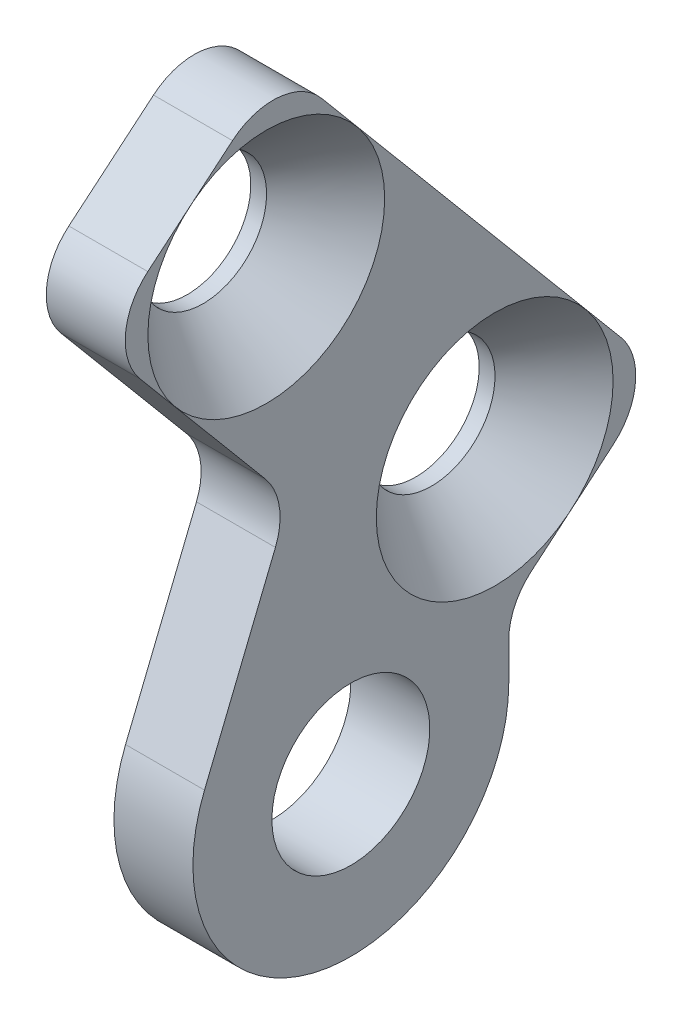
ISO-10303-21;
HEADER;
FILE_DESCRIPTION(('STEP AP214'),'2;1');
FILE_NAME('part.step','',(''),(''),'','','');
FILE_SCHEMA(('AUTOMOTIVE_DESIGN { 1 0 10303 214 1 1 1 1 }'));
ENDSEC;
DATA;
#1=APPLICATION_CONTEXT('core data for automotive mechanical design processes');
#2=APPLICATION_PROTOCOL_DEFINITION('international standard','automotive_design',2000,#1);
#3=PRODUCT_CONTEXT('',#1,'mechanical');
#4=PRODUCT('Part','Part','',(#3));
#5=PRODUCT_RELATED_PRODUCT_CATEGORY('part','',(#4));
#6=PRODUCT_DEFINITION_FORMATION('','',#4);
#7=PRODUCT_DEFINITION_CONTEXT('part definition',#1,'design');
#8=PRODUCT_DEFINITION('design','',#6,#7);
#9=PRODUCT_DEFINITION_SHAPE('','',#8);
#10=(LENGTH_UNIT() NAMED_UNIT(*) SI_UNIT(.MILLI.,.METRE.));
#11=(NAMED_UNIT(*) PLANE_ANGLE_UNIT() SI_UNIT($,.RADIAN.));
#12=(NAMED_UNIT(*) SI_UNIT($,.STERADIAN.) SOLID_ANGLE_UNIT());
#13=UNCERTAINTY_MEASURE_WITH_UNIT(LENGTH_MEASURE(1.E-05),#10,'distance_accuracy_value','');
#14=(GEOMETRIC_REPRESENTATION_CONTEXT(3) GLOBAL_UNCERTAINTY_ASSIGNED_CONTEXT((#13)) GLOBAL_UNIT_ASSIGNED_CONTEXT((#10,
#11,#12)) REPRESENTATION_CONTEXT('',''));
#15=CARTESIAN_POINT('',(0.,0.,0.));
#16=DIRECTION('',(0.,0.,1.));
#17=DIRECTION('',(1.,0.,0.));
#18=AXIS2_PLACEMENT_3D('',#15,#16,#17);
#19=CARTESIAN_POINT('',(-1.5875,9.52500000000001,-176.47164647412));
#20=DIRECTION('',(-1.,0.,0.));
#21=DIRECTION('',(0.,0.,1.));
#22=AXIS2_PLACEMENT_3D('',#19,#20,#21);
#23=PLANE('',#22);
#24=CARTESIAN_POINT('',(-1.58750000000001,9.52500000000001,-176.47164647412));
#25=DIRECTION('',(-1.,0.,0.));
#26=DIRECTION('',(0.,0.,1.));
#27=AXIS2_PLACEMENT_3D('',#24,#25,#26);
#28=CIRCLE('',#27,3.175);
#29=CARTESIAN_POINT('',(-1.58750000000001,9.52500000000001,-173.29664647412));
#30=VERTEX_POINT('',#29);
#31=EDGE_CURVE('E168',#30,#30,#28,.T.);
#32=ORIENTED_EDGE('',*,*,#31,.F.);
#33=EDGE_LOOP('',(#32));
#34=FACE_BOUND('',#33,.T.);
#35=CARTESIAN_POINT('',(-1.5875,28.8892429303716,-173.071588618471));
#36=DIRECTION('',(-1.,0.,0.));
#37=DIRECTION('',(0.,0.,1.));
#38=AXIS2_PLACEMENT_3D('',#35,#36,#37);
#39=CIRCLE('',#38,2.55269999999998);
#40=CARTESIAN_POINT('',(-1.5875,28.8892429303716,-170.518888618471));
#41=VERTEX_POINT('',#40);
#42=EDGE_CURVE('E256',#41,#41,#39,.T.);
#43=ORIENTED_EDGE('',*,*,#42,.F.);
#44=EDGE_LOOP('',(#43));
#45=FACE_BOUND('',#44,.T.);
#46=DIRECTION('',(0.,0.766044443118974,0.642787609686545));
#47=VECTOR('',#46,1.);
#48=CARTESIAN_POINT('',(-1.5875,81.5666029531743,-122.653033036499));
#49=LINE('',#48,#47);
#50=CARTESIAN_POINT('',(-1.5875,21.5268788651857,-173.032343374717));
#51=VERTEX_POINT('',#50);
#52=CARTESIAN_POINT('',(-1.5875,27.5305007140713,-167.994706495589));
#53=VERTEX_POINT('',#52);
#54=EDGE_CURVE('E143',#51,#53,#49,.T.);
#55=ORIENTED_EDGE('',*,*,#54,.T.);
#56=CARTESIAN_POINT('',(-1.5875,29.1631812426751,-169.940459381111));
#57=DIRECTION('',(-1.,0.,0.));
#58=DIRECTION('',(0.,0.,1.));
#59=AXIS2_PLACEMENT_3D('',#56,#57,#58);
#60=CIRCLE('',#59,2.54);
#61=CARTESIAN_POINT('',(-1.5875,31.1089341281973,-168.307778852507));
#62=VERTEX_POINT('',#61);
#63=EDGE_CURVE('E188',#53,#62,#60,.T.);
#64=ORIENTED_EDGE('',*,*,#63,.T.);
#65=DIRECTION('',(0.,0.642787609686545,-0.766044443118973));
#66=VECTOR('',#65,1.);
#67=CARTESIAN_POINT('',(-1.5875,30.4596506464192,-167.533992930486));
#68=LINE('',#67,#66);
#69=CARTESIAN_POINT('',(-1.5875,33.966125053254,-171.712846402171));
#70=VERTEX_POINT('',#69);
#71=EDGE_CURVE('E268',#62,#70,#68,.T.);
#72=ORIENTED_EDGE('',*,*,#71,.T.);
#73=CARTESIAN_POINT('',(-1.5875,32.0203721677318,-173.345526930775));
#74=DIRECTION('',(-1.,0.,0.));
#75=DIRECTION('',(0.,0.,1.));
#76=AXIS2_PLACEMENT_3D('',#73,#74,#75);
#77=CIRCLE('',#76,2.54);
#78=CARTESIAN_POINT('',(-1.5875,33.6530526963356,-175.291279816297));
#79=VERTEX_POINT('',#78);
#80=EDGE_CURVE('E186',#70,#79,#77,.T.);
#81=ORIENTED_EDGE('',*,*,#80,.T.);
#82=DIRECTION('',(0.,-0.766044443118974,-0.642787609686544));
#83=VECTOR('',#82,1.);
#84=CARTESIAN_POINT('',(-1.5875,87.6891549354387,-129.949606357207));
#85=LINE('',#84,#83);
#86=CARTESIAN_POINT('',(-1.5875,19.3031251656094,-187.33229871475));
#87=VERTEX_POINT('',#86);
#88=EDGE_CURVE('E265',#79,#87,#85,.T.);
#89=ORIENTED_EDGE('',*,*,#88,.T.);
#90=CARTESIAN_POINT('',(-1.5875,17.6704446370056,-185.386545829228));
#91=DIRECTION('',(-1.,0.,0.));
#92=DIRECTION('',(0.,0.,1.));
#93=AXIS2_PLACEMENT_3D('',#90,#91,#92);
#94=CIRCLE('',#93,2.54);
#95=CARTESIAN_POINT('',(-1.5875,15.7246917514834,-187.019226357832));
#96=VERTEX_POINT('',#95);
#97=EDGE_CURVE('E184',#87,#96,#94,.T.);
#98=ORIENTED_EDGE('',*,*,#97,.T.);
#99=DIRECTION('',(0.,-0.642787609686544,0.766044443118974));
#100=VECTOR('',#99,1.);
#101=CARTESIAN_POINT('',(-1.5875,12.2182173446486,-182.840372886147));
#102=LINE('',#101,#100);
#103=CARTESIAN_POINT('',(-1.5875,12.9638354530325,-183.728965945517));
#104=VERTEX_POINT('',#103);
#105=EDGE_CURVE('E263',#96,#104,#102,.T.);
#106=ORIENTED_EDGE('',*,*,#105,.T.);
#107=CARTESIAN_POINT('',(-1.5875,11.0180825675103,-185.36164647412));
#108=DIRECTION('',(-1.,0.,0.));
#109=DIRECTION('',(0.,0.,1.));
#110=AXIS2_PLACEMENT_3D('',#107,#108,#109);
#111=CIRCLE('',#110,2.54);
#112=CARTESIAN_POINT('',(-1.5875,11.0180825675103,-182.82164647412));
#113=VERTEX_POINT('',#112);
#114=EDGE_CURVE('E57',#104,#113,#111,.F.);
#115=ORIENTED_EDGE('',*,*,#114,.T.);
#116=DIRECTION('',(0.,-1.,0.));
#117=VECTOR('',#116,1.);
#118=CARTESIAN_POINT('',(-1.5875,82.55,-182.82164647412));
#119=LINE('',#118,#117);
#120=CARTESIAN_POINT('',(-1.5875,9.52500000000001,-182.82164647412));
#121=VERTEX_POINT('',#120);
#122=EDGE_CURVE('E149',#113,#121,#119,.T.);
#123=ORIENTED_EDGE('',*,*,#122,.T.);
#124=CARTESIAN_POINT('',(-1.5875,9.52500000000001,-176.47164647412));
#125=DIRECTION('',(-1.,0.,0.));
#126=DIRECTION('',(0.,0.,1.));
#127=AXIS2_PLACEMENT_3D('',#124,#125,#126);
#128=CIRCLE('',#127,6.34999999999999);
#129=CARTESIAN_POINT('',(-1.5875,11.9135952794059,-170.588015572101));
#130=VERTEX_POINT('',#129);
#131=EDGE_CURVE('E144',#121,#130,#128,.T.);
#132=ORIENTED_EDGE('',*,*,#131,.T.);
#133=DIRECTION('',(0.,0.926556047562137,-0.376156736914323));
#134=VECTOR('',#133,1.);
#135=CARTESIAN_POINT('',(-1.5875,56.2570524500952,-188.590261843887));
#136=LINE('',#135,#134);
#137=CARTESIAN_POINT('',(-1.5875,18.9387602248195,-173.440042850002));
#138=VERTEX_POINT('',#137);
#139=EDGE_CURVE('E133',#130,#138,#136,.T.);
#140=ORIENTED_EDGE('',*,*,#139,.T.);
#141=CARTESIAN_POINT('',(-1.5875,19.8941983365819,-171.086590489194));
#142=DIRECTION('',(-1.,0.,0.));
#143=DIRECTION('',(0.,0.,1.));
#144=AXIS2_PLACEMENT_3D('',#141,#142,#143);
#145=CIRCLE('',#144,2.54);
#146=EDGE_CURVE('E204',#138,#51,#145,.F.);
#147=ORIENTED_EDGE('',*,*,#146,.T.);
#148=EDGE_LOOP('',(#55,#64,#72,#81,#89,#98,#106,#115,#123,#132,#140,#147));
#149=FACE_BOUND('',#148,.T.);
#150=CARTESIAN_POINT('',(-1.5875,17.9443829493092,-182.255416591868));
#151=DIRECTION('',(-1.,0.,0.));
#152=DIRECTION('',(0.,0.,1.));
#153=AXIS2_PLACEMENT_3D('',#150,#151,#152);
#154=CIRCLE('',#153,2.55270000000004);
#155=CARTESIAN_POINT('',(-1.5875,17.9443829493092,-179.702716591868));
#156=VERTEX_POINT('',#155);
#157=EDGE_CURVE('E259',#156,#156,#154,.T.);
#158=ORIENTED_EDGE('',*,*,#157,.F.);
#159=EDGE_LOOP('',(#158));
#160=FACE_BOUND('',#159,.T.);
#161=ADVANCED_FACE('F41',(#34,#45,#149,#160),#23,.T.);
#162=CARTESIAN_POINT('',(1.5875,9.52500000000001,-176.47164647412));
#163=DIRECTION('',(-1.,0.,0.));
#164=DIRECTION('',(0.,0.,1.));
#165=AXIS2_PLACEMENT_3D('',#162,#163,#164);
#166=PLANE('',#165);
#167=CARTESIAN_POINT('',(1.5875,17.9443829493092,-182.255416591868));
#168=DIRECTION('',(-1.,0.,0.));
#169=DIRECTION('',(0.,0.,1.));
#170=AXIS2_PLACEMENT_3D('',#167,#168,#169);
#171=CIRCLE('',#170,4.76068831405327);
#172=CARTESIAN_POINT('',(1.5875,17.9443829493092,-177.494728277814));
#173=VERTEX_POINT('',#172);
#174=EDGE_CURVE('E212',#173,#173,#171,.T.);
#175=ORIENTED_EDGE('',*,*,#174,.T.);
#176=EDGE_LOOP('',(#175));
#177=FACE_BOUND('',#176,.T.);
#178=CARTESIAN_POINT('',(1.5875,28.8892429303716,-173.071588618471));
#179=DIRECTION('',(-1.,0.,0.));
#180=DIRECTION('',(0.,0.,1.));
#181=AXIS2_PLACEMENT_3D('',#178,#179,#180);
#182=CIRCLE('',#181,4.76068831405321);
#183=CARTESIAN_POINT('',(1.5875,28.8892429303716,-168.310900304418));
#184=VERTEX_POINT('',#183);
#185=EDGE_CURVE('E209',#184,#184,#182,.T.);
#186=ORIENTED_EDGE('',*,*,#185,.T.);
#187=EDGE_LOOP('',(#186));
#188=FACE_BOUND('',#187,.T.);
#189=CARTESIAN_POINT('',(1.5875,9.52500000000001,-176.47164647412));
#190=DIRECTION('',(-1.,0.,0.));
#191=DIRECTION('',(0.,0.,1.));
#192=AXIS2_PLACEMENT_3D('',#189,#190,#191);
#193=CIRCLE('',#192,3.175);
#194=CARTESIAN_POINT('',(1.5875,9.52500000000001,-173.29664647412));
#195=VERTEX_POINT('',#194);
#196=EDGE_CURVE('E166',#195,#195,#193,.T.);
#197=ORIENTED_EDGE('',*,*,#196,.T.);
#198=EDGE_LOOP('',(#197));
#199=FACE_BOUND('',#198,.T.);
#200=DIRECTION('',(0.,0.642787609686545,-0.766044443118973));
#201=VECTOR('',#200,1.);
#202=CARTESIAN_POINT('',(1.5875,30.4596506464192,-167.533992930486));
#203=LINE('',#202,#201);
#204=CARTESIAN_POINT('',(1.5875,31.1089341281973,-168.307778852507));
#205=VERTEX_POINT('',#204);
#206=CARTESIAN_POINT('',(1.5875,33.966125053254,-171.712846402171));
#207=VERTEX_POINT('',#206);
#208=EDGE_CURVE('E236',#205,#207,#203,.T.);
#209=ORIENTED_EDGE('',*,*,#208,.F.);
#210=CARTESIAN_POINT('',(1.5875,29.1631812426751,-169.940459381111));
#211=DIRECTION('',(-1.,0.,0.));
#212=DIRECTION('',(0.,0.,1.));
#213=AXIS2_PLACEMENT_3D('',#210,#211,#212);
#214=CIRCLE('',#213,2.54);
#215=CARTESIAN_POINT('',(1.5875,27.5305007140713,-167.994706495589));
#216=VERTEX_POINT('',#215);
#217=EDGE_CURVE('E182',#205,#216,#214,.F.);
#218=ORIENTED_EDGE('',*,*,#217,.T.);
#219=DIRECTION('',(0.,0.766044443118974,0.642787609686545));
#220=VECTOR('',#219,1.);
#221=CARTESIAN_POINT('',(1.5875,81.5666029531743,-122.653033036499));
#222=LINE('',#221,#220);
#223=CARTESIAN_POINT('',(1.5875,21.5268788651857,-173.032343374717));
#224=VERTEX_POINT('',#223);
#225=EDGE_CURVE('E243',#224,#216,#222,.T.);
#226=ORIENTED_EDGE('',*,*,#225,.F.);
#227=CARTESIAN_POINT('',(1.5875,19.8941983365819,-171.086590489194));
#228=DIRECTION('',(-1.,0.,0.));
#229=DIRECTION('',(0.,0.,1.));
#230=AXIS2_PLACEMENT_3D('',#227,#228,#229);
#231=CIRCLE('',#230,2.54);
#232=CARTESIAN_POINT('',(1.5875,18.9387602248195,-173.440042850002));
#233=VERTEX_POINT('',#232);
#234=EDGE_CURVE('E202',#224,#233,#231,.T.);
#235=ORIENTED_EDGE('',*,*,#234,.T.);
#236=DIRECTION('',(0.,0.926556047562137,-0.376156736914323));
#237=VECTOR('',#236,1.);
#238=CARTESIAN_POINT('',(1.5875,56.2570524500952,-188.590261843887));
#239=LINE('',#238,#237);
#240=CARTESIAN_POINT('',(1.5875,11.9135952794059,-170.588015572101));
#241=VERTEX_POINT('',#240);
#242=EDGE_CURVE('E248',#241,#233,#239,.T.);
#243=ORIENTED_EDGE('',*,*,#242,.F.);
#244=CARTESIAN_POINT('',(1.5875,9.52500000000001,-176.47164647412));
#245=DIRECTION('',(-1.,0.,0.));
#246=DIRECTION('',(0.,0.,1.));
#247=AXIS2_PLACEMENT_3D('',#244,#245,#246);
#248=CIRCLE('',#247,6.34999999999999);
#249=CARTESIAN_POINT('',(1.5875,9.52500000000001,-182.82164647412));
#250=VERTEX_POINT('',#249);
#251=EDGE_CURVE('E157',#250,#241,#248,.T.);
#252=ORIENTED_EDGE('',*,*,#251,.F.);
#253=DIRECTION('',(0.,-1.,0.));
#254=VECTOR('',#253,1.);
#255=CARTESIAN_POINT('',(1.5875,82.55,-182.82164647412));
#256=LINE('',#255,#254);
#257=CARTESIAN_POINT('',(1.5875,11.0180825675103,-182.82164647412));
#258=VERTEX_POINT('',#257);
#259=EDGE_CURVE('E153',#258,#250,#256,.T.);
#260=ORIENTED_EDGE('',*,*,#259,.F.);
#261=CARTESIAN_POINT('',(1.5875,11.0180825675103,-185.36164647412));
#262=DIRECTION('',(-1.,0.,0.));
#263=DIRECTION('',(0.,0.,1.));
#264=AXIS2_PLACEMENT_3D('',#261,#262,#263);
#265=CIRCLE('',#264,2.54);
#266=CARTESIAN_POINT('',(1.5875,12.9638354530325,-183.728965945517));
#267=VERTEX_POINT('',#266);
#268=EDGE_CURVE('E206',#258,#267,#265,.T.);
#269=ORIENTED_EDGE('',*,*,#268,.T.);
#270=DIRECTION('',(0.,-0.642787609686544,0.766044443118974));
#271=VECTOR('',#270,1.);
#272=CARTESIAN_POINT('',(1.5875,12.2182173446486,-182.840372886147));
#273=LINE('',#272,#271);
#274=CARTESIAN_POINT('',(1.5875,15.7246917514834,-187.019226357832));
#275=VERTEX_POINT('',#274);
#276=EDGE_CURVE('E246',#275,#267,#273,.T.);
#277=ORIENTED_EDGE('',*,*,#276,.F.);
#278=CARTESIAN_POINT('',(1.5875,17.6704446370056,-185.386545829228));
#279=DIRECTION('',(-1.,0.,0.));
#280=DIRECTION('',(0.,0.,1.));
#281=AXIS2_PLACEMENT_3D('',#278,#279,#280);
#282=CIRCLE('',#281,2.54);
#283=CARTESIAN_POINT('',(1.5875,19.3031251656094,-187.33229871475));
#284=VERTEX_POINT('',#283);
#285=EDGE_CURVE('E178',#275,#284,#282,.F.);
#286=ORIENTED_EDGE('',*,*,#285,.T.);
#287=DIRECTION('',(0.,-0.766044443118974,-0.642787609686544));
#288=VECTOR('',#287,1.);
#289=CARTESIAN_POINT('',(1.5875,87.6891549354387,-129.949606357207));
#290=LINE('',#289,#288);
#291=CARTESIAN_POINT('',(1.5875,33.6530526963356,-175.291279816297));
#292=VERTEX_POINT('',#291);
#293=EDGE_CURVE('E242',#292,#284,#290,.T.);
#294=ORIENTED_EDGE('',*,*,#293,.F.);
#295=CARTESIAN_POINT('',(1.5875,32.0203721677318,-173.345526930775));
#296=DIRECTION('',(-1.,0.,0.));
#297=DIRECTION('',(0.,0.,1.));
#298=AXIS2_PLACEMENT_3D('',#295,#296,#297);
#299=CIRCLE('',#298,2.54);
#300=EDGE_CURVE('E180',#292,#207,#299,.F.);
#301=ORIENTED_EDGE('',*,*,#300,.T.);
#302=EDGE_LOOP('',(#209,#218,#226,#235,#243,#252,#260,#269,#277,#286,#294,#301));
#303=FACE_BOUND('',#302,.T.);
#304=ADVANCED_FACE('F226',(#177,#188,#199,#303),#166,.F.);
#305=CARTESIAN_POINT('',(-1.5875,9.52500000000001,-176.47164647412));
#306=DIRECTION('',(1.,0.,0.));
#307=DIRECTION('',(0.,0.,-1.));
#308=AXIS2_PLACEMENT_3D('',#305,#306,#307);
#309=CYLINDRICAL_SURFACE('',#308,6.34999999999999);
#310=ORIENTED_EDGE('',*,*,#251,.T.);
#311=DIRECTION('',(1.,0.,0.));
#312=VECTOR('',#311,1.);
#313=CARTESIAN_POINT('',(-1.5875,11.9135952794059,-170.588015572101));
#314=LINE('',#313,#312);
#315=EDGE_CURVE('E138',#130,#241,#314,.T.);
#316=ORIENTED_EDGE('',*,*,#315,.F.);
#317=ORIENTED_EDGE('',*,*,#131,.F.);
#318=DIRECTION('',(1.,0.,0.));
#319=VECTOR('',#318,1.);
#320=CARTESIAN_POINT('',(-1.5875,9.52500000000001,-182.82164647412));
#321=LINE('',#320,#319);
#322=EDGE_CURVE('E159',#121,#250,#321,.T.);
#323=ORIENTED_EDGE('',*,*,#322,.T.);
#324=EDGE_LOOP('',(#310,#316,#317,#323));
#325=FACE_BOUND('',#324,.T.);
#326=ADVANCED_FACE('F155',(#325),#309,.T.);
#327=CARTESIAN_POINT('',(-1.5875,56.2570524500952,-188.590261843887));
#328=DIRECTION('',(0.,-0.376156736914323,-0.926556047562137));
#329=DIRECTION('',(0.,0.926556047562137,-0.376156736914323));
#330=AXIS2_PLACEMENT_3D('',#327,#328,#329);
#331=PLANE('',#330);
#332=ORIENTED_EDGE('',*,*,#242,.T.);
#333=DIRECTION('',(1.,0.,0.));
#334=VECTOR('',#333,1.);
#335=CARTESIAN_POINT('',(-1.5875,18.9387602248195,-173.440042850002));
#336=LINE('',#335,#334);
#337=EDGE_CURVE('E141',#233,#138,#336,.F.);
#338=ORIENTED_EDGE('',*,*,#337,.T.);
#339=ORIENTED_EDGE('',*,*,#139,.F.);
#340=ORIENTED_EDGE('',*,*,#315,.T.);
#341=EDGE_LOOP('',(#332,#338,#339,#340));
#342=FACE_BOUND('',#341,.T.);
#343=ADVANCED_FACE('F136',(#342),#331,.F.);
#344=CARTESIAN_POINT('',(-1.5875,81.5666029531743,-122.653033036499));
#345=DIRECTION('',(0.,0.642787609686545,-0.766044443118973));
#346=DIRECTION('',(0.,0.766044443118974,0.642787609686545));
#347=AXIS2_PLACEMENT_3D('',#344,#345,#346);
#348=PLANE('',#347);
#349=ORIENTED_EDGE('',*,*,#54,.F.);
#350=DIRECTION('',(1.,0.,0.));
#351=VECTOR('',#350,1.);
#352=CARTESIAN_POINT('',(1.5875,21.5268788651857,-173.032343374717));
#353=LINE('',#352,#351);
#354=EDGE_CURVE('E161',#51,#224,#353,.T.);
#355=ORIENTED_EDGE('',*,*,#354,.T.);
#356=ORIENTED_EDGE('',*,*,#225,.T.);
#357=DIRECTION('',(1.,0.,0.));
#358=VECTOR('',#357,1.);
#359=CARTESIAN_POINT('',(-1.5875,27.5305007140713,-167.994706495589));
#360=LINE('',#359,#358);
#361=EDGE_CURVE('E158',#216,#53,#360,.F.);
#362=ORIENTED_EDGE('',*,*,#361,.T.);
#363=EDGE_LOOP('',(#349,#355,#356,#362));
#364=FACE_BOUND('',#363,.T.);
#365=ADVANCED_FACE('F307',(#364),#348,.F.);
#366=CARTESIAN_POINT('',(-1.5875,30.4596506464192,-167.533992930486));
#367=DIRECTION('',(0.,-0.766044443118973,-0.642787609686545));
#368=DIRECTION('',(0.,0.642787609686545,-0.766044443118973));
#369=AXIS2_PLACEMENT_3D('',#366,#367,#368);
#370=PLANE('',#369);
#371=ORIENTED_EDGE('',*,*,#71,.F.);
#372=DIRECTION('',(1.,0.,0.));
#373=VECTOR('',#372,1.);
#374=CARTESIAN_POINT('',(-1.5875,31.1089341281973,-168.307778852507));
#375=LINE('',#374,#373);
#376=EDGE_CURVE('E175',#62,#205,#375,.T.);
#377=ORIENTED_EDGE('',*,*,#376,.T.);
#378=ORIENTED_EDGE('',*,*,#208,.T.);
#379=DIRECTION('',(1.,0.,0.));
#380=VECTOR('',#379,1.);
#381=CARTESIAN_POINT('',(-1.5875,33.966125053254,-171.712846402171));
#382=LINE('',#381,#380);
#383=EDGE_CURVE('E173',#207,#70,#382,.F.);
#384=ORIENTED_EDGE('',*,*,#383,.T.);
#385=EDGE_LOOP('',(#371,#377,#378,#384));
#386=FACE_BOUND('',#385,.T.);
#387=ADVANCED_FACE('F303',(#386),#370,.F.);
#388=CARTESIAN_POINT('',(-1.5875,87.6891549354387,-129.949606357207));
#389=DIRECTION('',(0.,-0.642787609686544,0.766044443118974));
#390=DIRECTION('',(0.,-0.766044443118974,-0.642787609686544));
#391=AXIS2_PLACEMENT_3D('',#388,#389,#390);
#392=PLANE('',#391);
#393=ORIENTED_EDGE('',*,*,#88,.F.);
#394=DIRECTION('',(1.,0.,0.));
#395=VECTOR('',#394,1.);
#396=CARTESIAN_POINT('',(-1.5875,33.6530526963356,-175.291279816297));
#397=LINE('',#396,#395);
#398=EDGE_CURVE('E192',#79,#292,#397,.T.);
#399=ORIENTED_EDGE('',*,*,#398,.T.);
#400=ORIENTED_EDGE('',*,*,#293,.T.);
#401=DIRECTION('',(1.,0.,0.));
#402=VECTOR('',#401,1.);
#403=CARTESIAN_POINT('',(-1.5875,19.3031251656095,-187.33229871475));
#404=LINE('',#403,#402);
#405=EDGE_CURVE('E190',#284,#87,#404,.F.);
#406=ORIENTED_EDGE('',*,*,#405,.T.);
#407=EDGE_LOOP('',(#393,#399,#400,#406));
#408=FACE_BOUND('',#407,.T.);
#409=ADVANCED_FACE('F300',(#408),#392,.F.);
#410=CARTESIAN_POINT('',(-1.5875,12.2182173446486,-182.840372886147));
#411=DIRECTION('',(0.,0.766044443118974,0.642787609686544));
#412=DIRECTION('',(0.,-0.642787609686544,0.766044443118974));
#413=AXIS2_PLACEMENT_3D('',#410,#411,#412);
#414=PLANE('',#413);
#415=ORIENTED_EDGE('',*,*,#105,.F.);
#416=DIRECTION('',(1.,0.,0.));
#417=VECTOR('',#416,1.);
#418=CARTESIAN_POINT('',(-1.5875,15.7246917514834,-187.019226357832));
#419=LINE('',#418,#417);
#420=EDGE_CURVE('E196',#96,#275,#419,.T.);
#421=ORIENTED_EDGE('',*,*,#420,.T.);
#422=ORIENTED_EDGE('',*,*,#276,.T.);
#423=DIRECTION('',(1.,0.,0.));
#424=VECTOR('',#423,1.);
#425=CARTESIAN_POINT('',(-1.5875,12.9638354530325,-183.728965945517));
#426=LINE('',#425,#424);
#427=EDGE_CURVE('E65',#267,#104,#426,.F.);
#428=ORIENTED_EDGE('',*,*,#427,.T.);
#429=EDGE_LOOP('',(#415,#421,#422,#428));
#430=FACE_BOUND('',#429,.T.);
#431=ADVANCED_FACE('F294',(#430),#414,.F.);
#432=CARTESIAN_POINT('',(-1.5875,82.55,-182.82164647412));
#433=DIRECTION('',(0.,0.,1.));
#434=DIRECTION('',(1.,0.,0.));
#435=AXIS2_PLACEMENT_3D('',#432,#433,#434);
#436=PLANE('',#435);
#437=ORIENTED_EDGE('',*,*,#122,.F.);
#438=DIRECTION('',(1.,0.,0.));
#439=VECTOR('',#438,1.);
#440=CARTESIAN_POINT('',(1.5875,11.0180825675103,-182.82164647412));
#441=LINE('',#440,#439);
#442=EDGE_CURVE('E199',#113,#258,#441,.T.);
#443=ORIENTED_EDGE('',*,*,#442,.T.);
#444=ORIENTED_EDGE('',*,*,#259,.T.);
#445=ORIENTED_EDGE('',*,*,#322,.F.);
#446=EDGE_LOOP('',(#437,#443,#444,#445));
#447=FACE_BOUND('',#446,.T.);
#448=ADVANCED_FACE('F254',(#447),#436,.F.);
#449=CARTESIAN_POINT('',(-1.5875,28.8892429303716,-173.071588618471));
#450=DIRECTION('',(1.,0.,0.));
#451=DIRECTION('',(0.,0.,-1.));
#452=AXIS2_PLACEMENT_3D('',#449,#450,#451);
#453=CYLINDRICAL_SURFACE('',#452,2.55269999999998);
#454=CARTESIAN_POINT('',(-0.952499999999989,28.8892429303716,-173.071588618471));
#455=DIRECTION('',(-1.,0.,0.));
#456=DIRECTION('',(0.,0.,1.));
#457=AXIS2_PLACEMENT_3D('',#454,#455,#456);
#458=CIRCLE('',#457,2.55269999999998);
#459=CARTESIAN_POINT('',(-0.952499999999989,28.8892429303716,-170.518888618471));
#460=VERTEX_POINT('',#459);
#461=EDGE_CURVE('E11',#460,#460,#458,.F.);
#462=ORIENTED_EDGE('',*,*,#461,.T.);
#463=EDGE_LOOP('',(#462));
#464=FACE_BOUND('',#463,.T.);
#465=ORIENTED_EDGE('',*,*,#42,.T.);
#466=EDGE_LOOP('',(#465));
#467=FACE_BOUND('',#466,.T.);
#468=ADVANCED_FACE('F285',(#464,#467),#453,.F.);
#469=CARTESIAN_POINT('',(-1.5875,17.9443829493092,-182.255416591868));
#470=DIRECTION('',(1.,0.,0.));
#471=DIRECTION('',(0.,0.,-1.));
#472=AXIS2_PLACEMENT_3D('',#469,#470,#471);
#473=CYLINDRICAL_SURFACE('',#472,2.55270000000004);
#474=CARTESIAN_POINT('',(-0.952499999999995,17.9443829493092,-182.255416591868));
#475=DIRECTION('',(-1.,0.,0.));
#476=DIRECTION('',(0.,0.,1.));
#477=AXIS2_PLACEMENT_3D('',#474,#475,#476);
#478=CIRCLE('',#477,2.55270000000004);
#479=CARTESIAN_POINT('',(-0.952499999999995,17.9443829493092,-179.702716591868));
#480=VERTEX_POINT('',#479);
#481=EDGE_CURVE('E50',#480,#480,#478,.F.);
#482=ORIENTED_EDGE('',*,*,#481,.T.);
#483=EDGE_LOOP('',(#482));
#484=FACE_BOUND('',#483,.T.);
#485=ORIENTED_EDGE('',*,*,#157,.T.);
#486=EDGE_LOOP('',(#485));
#487=FACE_BOUND('',#486,.T.);
#488=ADVANCED_FACE('F217',(#484,#487),#473,.F.);
#489=CARTESIAN_POINT('',(240.9346312661,9.52500000000001,-176.47164647412));
#490=DIRECTION('',(-1.,0.,0.));
#491=DIRECTION('',(0.,0.,1.));
#492=AXIS2_PLACEMENT_3D('',#489,#490,#491);
#493=CYLINDRICAL_SURFACE('',#492,3.175);
#494=ORIENTED_EDGE('',*,*,#31,.T.);
#495=EDGE_LOOP('',(#494));
#496=FACE_BOUND('',#495,.T.);
#497=ORIENTED_EDGE('',*,*,#196,.F.);
#498=EDGE_LOOP('',(#497));
#499=FACE_BOUND('',#498,.T.);
#500=ADVANCED_FACE('F277',(#496,#499),#493,.F.);
#501=CARTESIAN_POINT('',(-1.5875,19.8941983365819,-171.086590489194));
#502=DIRECTION('',(-1.,0.,0.));
#503=DIRECTION('',(0.,0.,1.));
#504=AXIS2_PLACEMENT_3D('',#501,#502,#503);
#505=CYLINDRICAL_SURFACE('',#504,2.54);
#506=ORIENTED_EDGE('',*,*,#146,.F.);
#507=ORIENTED_EDGE('',*,*,#337,.F.);
#508=ORIENTED_EDGE('',*,*,#234,.F.);
#509=ORIENTED_EDGE('',*,*,#354,.F.);
#510=EDGE_LOOP('',(#506,#507,#508,#509));
#511=FACE_BOUND('',#510,.T.);
#512=ADVANCED_FACE('F315',(#511),#505,.F.);
#513=CARTESIAN_POINT('',(-1.5875,29.1631812426751,-169.940459381111));
#514=DIRECTION('',(1.,0.,0.));
#515=DIRECTION('',(0.,0.,-1.));
#516=AXIS2_PLACEMENT_3D('',#513,#514,#515);
#517=CYLINDRICAL_SURFACE('',#516,2.54);
#518=ORIENTED_EDGE('',*,*,#63,.F.);
#519=ORIENTED_EDGE('',*,*,#361,.F.);
#520=ORIENTED_EDGE('',*,*,#217,.F.);
#521=ORIENTED_EDGE('',*,*,#376,.F.);
#522=EDGE_LOOP('',(#518,#519,#520,#521));
#523=FACE_BOUND('',#522,.T.);
#524=ADVANCED_FACE('F318',(#523),#517,.T.);
#525=CARTESIAN_POINT('',(-1.5875,32.0203721677318,-173.345526930775));
#526=DIRECTION('',(1.,0.,0.));
#527=DIRECTION('',(0.,0.,-1.));
#528=AXIS2_PLACEMENT_3D('',#525,#526,#527);
#529=CYLINDRICAL_SURFACE('',#528,2.54);
#530=ORIENTED_EDGE('',*,*,#80,.F.);
#531=ORIENTED_EDGE('',*,*,#383,.F.);
#532=ORIENTED_EDGE('',*,*,#300,.F.);
#533=ORIENTED_EDGE('',*,*,#398,.F.);
#534=EDGE_LOOP('',(#530,#531,#532,#533));
#535=FACE_BOUND('',#534,.T.);
#536=ADVANCED_FACE('F322',(#535),#529,.T.);
#537=CARTESIAN_POINT('',(-1.5875,17.6704446370056,-185.386545829228));
#538=DIRECTION('',(1.,0.,0.));
#539=DIRECTION('',(0.,0.,-1.));
#540=AXIS2_PLACEMENT_3D('',#537,#538,#539);
#541=CYLINDRICAL_SURFACE('',#540,2.54);
#542=ORIENTED_EDGE('',*,*,#97,.F.);
#543=ORIENTED_EDGE('',*,*,#405,.F.);
#544=ORIENTED_EDGE('',*,*,#285,.F.);
#545=ORIENTED_EDGE('',*,*,#420,.F.);
#546=EDGE_LOOP('',(#542,#543,#544,#545));
#547=FACE_BOUND('',#546,.T.);
#548=ADVANCED_FACE('F326',(#547),#541,.T.);
#549=CARTESIAN_POINT('',(-1.5875,11.0180825675103,-185.36164647412));
#550=DIRECTION('',(-1.,0.,0.));
#551=DIRECTION('',(0.,0.,1.));
#552=AXIS2_PLACEMENT_3D('',#549,#550,#551);
#553=CYLINDRICAL_SURFACE('',#552,2.54);
#554=ORIENTED_EDGE('',*,*,#114,.F.);
#555=ORIENTED_EDGE('',*,*,#427,.F.);
#556=ORIENTED_EDGE('',*,*,#268,.F.);
#557=ORIENTED_EDGE('',*,*,#442,.F.);
#558=EDGE_LOOP('',(#554,#555,#556,#557));
#559=FACE_BOUND('',#558,.T.);
#560=ADVANCED_FACE('F223',(#559),#553,.F.);
#561=CARTESIAN_POINT('',(1.5875,17.9443829493092,-182.255416591868));
#562=DIRECTION('',(1.,0.,0.));
#563=DIRECTION('',(0.,0.,-1.));
#564=AXIS2_PLACEMENT_3D('',#561,#562,#563);
#565=CONICAL_SURFACE('',#564,4.76068831405327,0.715584993317679);
#566=ORIENTED_EDGE('',*,*,#481,.F.);
#567=EDGE_LOOP('',(#566));
#568=FACE_BOUND('',#567,.T.);
#569=ORIENTED_EDGE('',*,*,#174,.F.);
#570=EDGE_LOOP('',(#569));
#571=FACE_BOUND('',#570,.T.);
#572=ADVANCED_FACE('F220',(#568,#571),#565,.F.);
#573=CARTESIAN_POINT('',(1.5875,28.8892429303716,-173.071588618471));
#574=DIRECTION('',(1.,0.,0.));
#575=DIRECTION('',(0.,0.,-1.));
#576=AXIS2_PLACEMENT_3D('',#573,#574,#575);
#577=CONICAL_SURFACE('',#576,4.76068831405321,0.715584993317681);
#578=ORIENTED_EDGE('',*,*,#461,.F.);
#579=EDGE_LOOP('',(#578));
#580=FACE_BOUND('',#579,.T.);
#581=ORIENTED_EDGE('',*,*,#185,.F.);
#582=EDGE_LOOP('',(#581));
#583=FACE_BOUND('',#582,.T.);
#584=ADVANCED_FACE('F44',(#580,#583),#577,.F.);
#585=CLOSED_SHELL('',(#161,#304,#326,#343,#365,#387,#409,#431,#448,#468,#488,#500,#512,#524,
#536,#548,#560,#572,#584));
#586=MANIFOLD_SOLID_BREP('B2',#585);
#587=ADVANCED_BREP_SHAPE_REPRESENTATION('',(#18,#586),#14);
#588=SHAPE_DEFINITION_REPRESENTATION(#9,#587);
ENDSEC;
END-ISO-10303-21;
